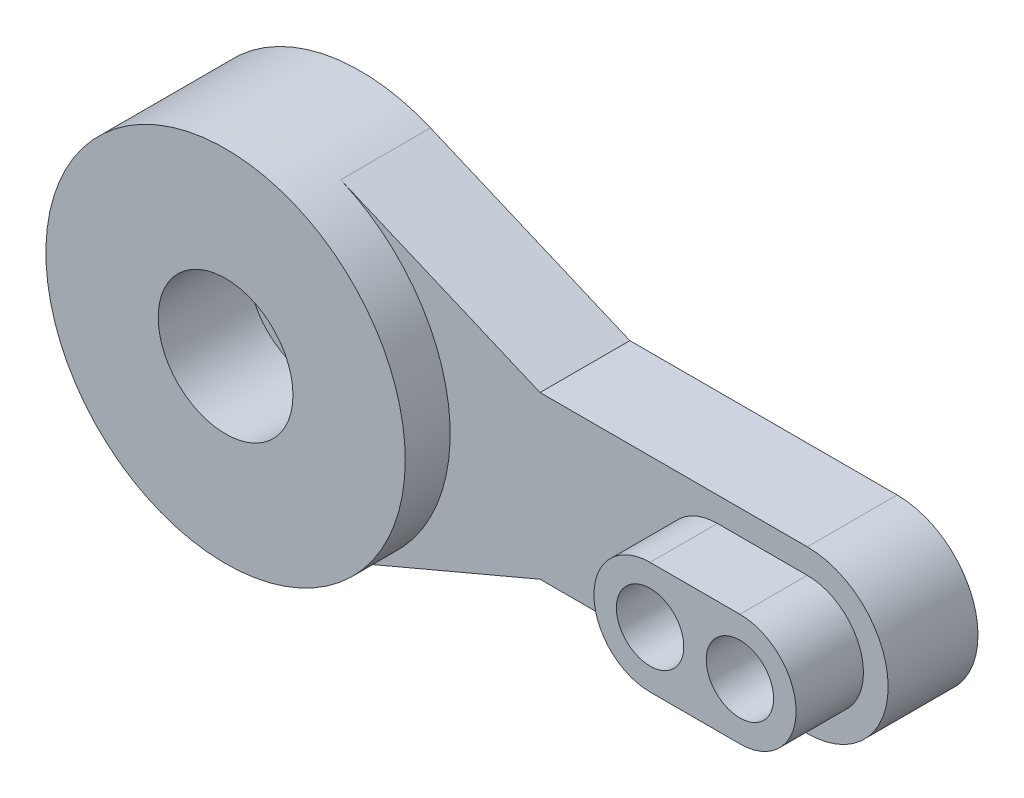
ISO-10303-21;
HEADER;
FILE_DESCRIPTION(('STEP AP214'),'2;1');
FILE_NAME('part.step','',(''),(''),'','','');
FILE_SCHEMA(('AUTOMOTIVE_DESIGN { 1 0 10303 214 1 1 1 1 }'));
ENDSEC;
DATA;
#1=APPLICATION_CONTEXT('core data for automotive mechanical design processes');
#2=APPLICATION_PROTOCOL_DEFINITION('international standard','automotive_design',2000,#1);
#3=PRODUCT_CONTEXT('',#1,'mechanical');
#4=PRODUCT('Part','Part','',(#3));
#5=PRODUCT_RELATED_PRODUCT_CATEGORY('part','',(#4));
#6=PRODUCT_DEFINITION_FORMATION('','',#4);
#7=PRODUCT_DEFINITION_CONTEXT('part definition',#1,'design');
#8=PRODUCT_DEFINITION('design','',#6,#7);
#9=PRODUCT_DEFINITION_SHAPE('','',#8);
#10=(LENGTH_UNIT() NAMED_UNIT(*) SI_UNIT(.MILLI.,.METRE.));
#11=(NAMED_UNIT(*) PLANE_ANGLE_UNIT() SI_UNIT($,.RADIAN.));
#12=(NAMED_UNIT(*) SI_UNIT($,.STERADIAN.) SOLID_ANGLE_UNIT());
#13=UNCERTAINTY_MEASURE_WITH_UNIT(LENGTH_MEASURE(1.E-05),#10,'distance_accuracy_value','');
#14=(GEOMETRIC_REPRESENTATION_CONTEXT(3) GLOBAL_UNCERTAINTY_ASSIGNED_CONTEXT((#13)) GLOBAL_UNIT_ASSIGNED_CONTEXT((#10,
#11,#12)) REPRESENTATION_CONTEXT('',''));
#15=CARTESIAN_POINT('',(0.,0.,0.));
#16=DIRECTION('',(0.,0.,1.));
#17=DIRECTION('',(1.,0.,0.));
#18=AXIS2_PLACEMENT_3D('',#15,#16,#17);
#19=CARTESIAN_POINT('',(0.,0.,4.));
#20=DIRECTION('',(0.,0.,1.));
#21=DIRECTION('',(1.,0.,0.));
#22=AXIS2_PLACEMENT_3D('',#19,#20,#21);
#23=PLANE('',#22);
#24=CARTESIAN_POINT('',(0.,0.,4.));
#25=DIRECTION('',(0.,0.,1.));
#26=DIRECTION('',(1.,0.,0.));
#27=AXIS2_PLACEMENT_3D('',#24,#25,#26);
#28=CIRCLE('',#27,8.);
#29=CARTESIAN_POINT('',(3.12386973066267,-7.36487867556891,4.));
#30=VERTEX_POINT('',#29);
#31=CARTESIAN_POINT('',(3.12386973066266,7.3648786755689,4.));
#32=VERTEX_POINT('',#31);
#33=EDGE_CURVE('E12',#30,#32,#28,.T.);
#34=ORIENTED_EDGE('',*,*,#33,.F.);
#35=DIRECTION('',(0.920609834446113,0.390483716332833,0.));
#36=VECTOR('',#35,1.);
#37=CARTESIAN_POINT('',(3.12386973066267,-7.36487867556891,4.));
#38=LINE('',#37,#36);
#39=CARTESIAN_POINT('',(12.,-3.6,4.));
#40=VERTEX_POINT('',#39);
#41=EDGE_CURVE('E106',#30,#40,#38,.T.);
#42=ORIENTED_EDGE('',*,*,#41,.T.);
#43=DIRECTION('',(1.,0.,0.));
#44=VECTOR('',#43,1.);
#45=CARTESIAN_POINT('',(12.,-3.6,4.));
#46=LINE('',#45,#44);
#47=CARTESIAN_POINT('',(23.9,-3.6,4.));
#48=VERTEX_POINT('',#47);
#49=EDGE_CURVE('E100',#40,#48,#46,.T.);
#50=ORIENTED_EDGE('',*,*,#49,.T.);
#51=CARTESIAN_POINT('',(23.9,0.,4.));
#52=DIRECTION('',(0.,0.,1.));
#53=DIRECTION('',(1.,0.,0.));
#54=AXIS2_PLACEMENT_3D('',#51,#52,#53);
#55=CIRCLE('',#54,3.6);
#56=CARTESIAN_POINT('',(23.9,3.6,4.));
#57=VERTEX_POINT('',#56);
#58=EDGE_CURVE('E104',#48,#57,#55,.T.);
#59=ORIENTED_EDGE('',*,*,#58,.T.);
#60=DIRECTION('',(-1.,0.,0.));
#61=VECTOR('',#60,1.);
#62=CARTESIAN_POINT('',(12.,3.6,4.));
#63=LINE('',#62,#61);
#64=CARTESIAN_POINT('',(12.,3.6,4.));
#65=VERTEX_POINT('',#64);
#66=EDGE_CURVE('E60',#57,#65,#63,.T.);
#67=ORIENTED_EDGE('',*,*,#66,.T.);
#68=DIRECTION('',(-0.920609834446113,0.390483716332833,0.));
#69=VECTOR('',#68,1.);
#70=CARTESIAN_POINT('',(3.12386973066267,7.36487867556891,4.));
#71=LINE('',#70,#69);
#72=EDGE_CURVE('E124',#65,#32,#71,.T.);
#73=ORIENTED_EDGE('',*,*,#72,.T.);
#74=EDGE_LOOP('',(#34,#42,#50,#59,#67,#73));
#75=FACE_BOUND('',#74,.T.);
#76=DIRECTION('',(-1.,0.,0.));
#77=VECTOR('',#76,1.);
#78=CARTESIAN_POINT('',(23.9,2.5,4.));
#79=LINE('',#78,#77);
#80=CARTESIAN_POINT('',(23.9,2.5,4.));
#81=VERTEX_POINT('',#80);
#82=CARTESIAN_POINT('',(19.9,2.5,4.));
#83=VERTEX_POINT('',#82);
#84=EDGE_CURVE('E200',#81,#83,#79,.T.);
#85=ORIENTED_EDGE('',*,*,#84,.F.);
#86=CARTESIAN_POINT('',(23.9,0.,4.));
#87=DIRECTION('',(0.,0.,1.));
#88=DIRECTION('',(1.,0.,0.));
#89=AXIS2_PLACEMENT_3D('',#86,#87,#88);
#90=CIRCLE('',#89,2.5);
#91=CARTESIAN_POINT('',(23.9,-2.5,4.));
#92=VERTEX_POINT('',#91);
#93=EDGE_CURVE('E211',#92,#81,#90,.T.);
#94=ORIENTED_EDGE('',*,*,#93,.F.);
#95=DIRECTION('',(1.,0.,0.));
#96=VECTOR('',#95,1.);
#97=CARTESIAN_POINT('',(23.9,-2.5,4.));
#98=LINE('',#97,#96);
#99=CARTESIAN_POINT('',(19.9,-2.5,4.));
#100=VERTEX_POINT('',#99);
#101=EDGE_CURVE('E181',#100,#92,#98,.T.);
#102=ORIENTED_EDGE('',*,*,#101,.F.);
#103=CARTESIAN_POINT('',(19.9,0.,4.));
#104=DIRECTION('',(0.,0.,1.));
#105=DIRECTION('',(1.,0.,0.));
#106=AXIS2_PLACEMENT_3D('',#103,#104,#105);
#107=CIRCLE('',#106,2.5);
#108=EDGE_CURVE('E216',#83,#100,#107,.T.);
#109=ORIENTED_EDGE('',*,*,#108,.F.);
#110=EDGE_LOOP('',(#85,#94,#102,#109));
#111=FACE_BOUND('',#110,.T.);
#112=ADVANCED_FACE('F35',(#75,#111),#23,.T.);
#113=CARTESIAN_POINT('',(0.,0.,4.));
#114=DIRECTION('',(0.,0.,-1.));
#115=DIRECTION('',(-1.,0.,0.));
#116=AXIS2_PLACEMENT_3D('',#113,#114,#115);
#117=CYLINDRICAL_SURFACE('',#116,8.);
#118=CARTESIAN_POINT('',(0.,0.,0.));
#119=DIRECTION('',(0.,0.,1.));
#120=DIRECTION('',(1.,0.,0.));
#121=AXIS2_PLACEMENT_3D('',#118,#119,#120);
#122=CIRCLE('',#121,8.);
#123=CARTESIAN_POINT('',(3.12386973066267,7.36487867556891,0.));
#124=VERTEX_POINT('',#123);
#125=CARTESIAN_POINT('',(3.12386973066267,-7.36487867556891,0.));
#126=VERTEX_POINT('',#125);
#127=EDGE_CURVE('E130',#124,#126,#122,.T.);
#128=ORIENTED_EDGE('',*,*,#127,.T.);
#129=DIRECTION('',(0.,0.,-1.));
#130=VECTOR('',#129,1.);
#131=CARTESIAN_POINT('',(3.12386973066267,-7.36487867556891,4.));
#132=LINE('',#131,#130);
#133=EDGE_CURVE('E39',#30,#126,#132,.T.);
#134=ORIENTED_EDGE('',*,*,#133,.F.);
#135=ORIENTED_EDGE('',*,*,#33,.T.);
#136=DIRECTION('',(0.,0.,-1.));
#137=VECTOR('',#136,1.);
#138=CARTESIAN_POINT('',(3.12386973066267,7.36487867556891,4.));
#139=LINE('',#138,#137);
#140=EDGE_CURVE('E129',#32,#124,#139,.T.);
#141=ORIENTED_EDGE('',*,*,#140,.T.);
#142=EDGE_LOOP('',(#128,#134,#135,#141));
#143=FACE_BOUND('',#142,.T.);
#144=CARTESIAN_POINT('',(0.,0.,6.));
#145=DIRECTION('',(0.,0.,1.));
#146=DIRECTION('',(1.,0.,0.));
#147=AXIS2_PLACEMENT_3D('',#144,#145,#146);
#148=CIRCLE('',#147,8.);
#149=CARTESIAN_POINT('',(8.,0.,6.));
#150=VERTEX_POINT('',#149);
#151=EDGE_CURVE('E134',#150,#150,#148,.T.);
#152=ORIENTED_EDGE('',*,*,#151,.F.);
#153=EDGE_LOOP('',(#152));
#154=FACE_BOUND('',#153,.T.);
#155=ADVANCED_FACE('F37',(#143,#154),#117,.T.);
#156=CARTESIAN_POINT('',(3.12386973066267,-7.36487867556891,4.));
#157=DIRECTION('',(-0.390483716332833,0.920609834446113,0.));
#158=DIRECTION('',(-0.920609834446113,-0.390483716332833,0.));
#159=AXIS2_PLACEMENT_3D('',#156,#157,#158);
#160=PLANE('',#159);
#161=DIRECTION('',(0.920609834446113,0.390483716332833,0.));
#162=VECTOR('',#161,1.);
#163=CARTESIAN_POINT('',(3.12386973066267,-7.36487867556891,0.));
#164=LINE('',#163,#162);
#165=CARTESIAN_POINT('',(12.,-3.6,0.));
#166=VERTEX_POINT('',#165);
#167=EDGE_CURVE('E133',#126,#166,#164,.T.);
#168=ORIENTED_EDGE('',*,*,#167,.T.);
#169=DIRECTION('',(0.,0.,-1.));
#170=VECTOR('',#169,1.);
#171=CARTESIAN_POINT('',(12.,-3.6,4.));
#172=LINE('',#171,#170);
#173=EDGE_CURVE('E118',#40,#166,#172,.T.);
#174=ORIENTED_EDGE('',*,*,#173,.F.);
#175=ORIENTED_EDGE('',*,*,#41,.F.);
#176=ORIENTED_EDGE('',*,*,#133,.T.);
#177=EDGE_LOOP('',(#168,#174,#175,#176));
#178=FACE_BOUND('',#177,.T.);
#179=ADVANCED_FACE('F148',(#178),#160,.F.);
#180=CARTESIAN_POINT('',(12.,-3.6,4.));
#181=DIRECTION('',(0.,1.,0.));
#182=DIRECTION('',(-1.,0.,0.));
#183=AXIS2_PLACEMENT_3D('',#180,#181,#182);
#184=PLANE('',#183);
#185=DIRECTION('',(1.,0.,0.));
#186=VECTOR('',#185,1.);
#187=CARTESIAN_POINT('',(12.,-3.6,0.));
#188=LINE('',#187,#186);
#189=CARTESIAN_POINT('',(23.9,-3.6,0.));
#190=VERTEX_POINT('',#189);
#191=EDGE_CURVE('E115',#166,#190,#188,.T.);
#192=ORIENTED_EDGE('',*,*,#191,.T.);
#193=DIRECTION('',(0.,0.,-1.));
#194=VECTOR('',#193,1.);
#195=CARTESIAN_POINT('',(23.9,-3.6,4.));
#196=LINE('',#195,#194);
#197=EDGE_CURVE('E112',#48,#190,#196,.T.);
#198=ORIENTED_EDGE('',*,*,#197,.F.);
#199=ORIENTED_EDGE('',*,*,#49,.F.);
#200=ORIENTED_EDGE('',*,*,#173,.T.);
#201=EDGE_LOOP('',(#192,#198,#199,#200));
#202=FACE_BOUND('',#201,.T.);
#203=ADVANCED_FACE('F113',(#202),#184,.F.);
#204=CARTESIAN_POINT('',(23.9,0.,4.));
#205=DIRECTION('',(0.,0.,-1.));
#206=DIRECTION('',(-1.,0.,0.));
#207=AXIS2_PLACEMENT_3D('',#204,#205,#206);
#208=CYLINDRICAL_SURFACE('',#207,3.6);
#209=CARTESIAN_POINT('',(23.9,0.,0.));
#210=DIRECTION('',(0.,0.,1.));
#211=DIRECTION('',(1.,0.,0.));
#212=AXIS2_PLACEMENT_3D('',#209,#210,#211);
#213=CIRCLE('',#212,3.6);
#214=CARTESIAN_POINT('',(23.9,3.6,0.));
#215=VERTEX_POINT('',#214);
#216=EDGE_CURVE('E137',#190,#215,#213,.T.);
#217=ORIENTED_EDGE('',*,*,#216,.T.);
#218=DIRECTION('',(0.,0.,-1.));
#219=VECTOR('',#218,1.);
#220=CARTESIAN_POINT('',(23.9,3.6,4.));
#221=LINE('',#220,#219);
#222=EDGE_CURVE('E119',#57,#215,#221,.T.);
#223=ORIENTED_EDGE('',*,*,#222,.F.);
#224=ORIENTED_EDGE('',*,*,#58,.F.);
#225=ORIENTED_EDGE('',*,*,#197,.T.);
#226=EDGE_LOOP('',(#217,#223,#224,#225));
#227=FACE_BOUND('',#226,.T.);
#228=ADVANCED_FACE('F121',(#227),#208,.T.);
#229=CARTESIAN_POINT('',(12.,3.6,4.));
#230=DIRECTION('',(0.,-1.,0.));
#231=DIRECTION('',(1.,0.,0.));
#232=AXIS2_PLACEMENT_3D('',#229,#230,#231);
#233=PLANE('',#232);
#234=DIRECTION('',(-1.,0.,0.));
#235=VECTOR('',#234,1.);
#236=CARTESIAN_POINT('',(12.,3.6,0.));
#237=LINE('',#236,#235);
#238=CARTESIAN_POINT('',(12.,3.6,0.));
#239=VERTEX_POINT('',#238);
#240=EDGE_CURVE('E139',#215,#239,#237,.T.);
#241=ORIENTED_EDGE('',*,*,#240,.T.);
#242=DIRECTION('',(0.,0.,-1.));
#243=VECTOR('',#242,1.);
#244=CARTESIAN_POINT('',(12.,3.6,4.));
#245=LINE('',#244,#243);
#246=EDGE_CURVE('E143',#65,#239,#245,.T.);
#247=ORIENTED_EDGE('',*,*,#246,.F.);
#248=ORIENTED_EDGE('',*,*,#66,.F.);
#249=ORIENTED_EDGE('',*,*,#222,.T.);
#250=EDGE_LOOP('',(#241,#247,#248,#249));
#251=FACE_BOUND('',#250,.T.);
#252=ADVANCED_FACE('F157',(#251),#233,.F.);
#253=CARTESIAN_POINT('',(3.12386973066267,7.36487867556891,4.));
#254=DIRECTION('',(-0.390483716332833,-0.920609834446113,0.));
#255=DIRECTION('',(0.920609834446113,-0.390483716332833,0.));
#256=AXIS2_PLACEMENT_3D('',#253,#254,#255);
#257=PLANE('',#256);
#258=DIRECTION('',(-0.920609834446113,0.390483716332833,0.));
#259=VECTOR('',#258,1.);
#260=CARTESIAN_POINT('',(3.12386973066267,7.36487867556891,0.));
#261=LINE('',#260,#259);
#262=EDGE_CURVE('E88',#239,#124,#261,.T.);
#263=ORIENTED_EDGE('',*,*,#262,.T.);
#264=ORIENTED_EDGE('',*,*,#140,.F.);
#265=ORIENTED_EDGE('',*,*,#72,.F.);
#266=ORIENTED_EDGE('',*,*,#246,.T.);
#267=EDGE_LOOP('',(#263,#264,#265,#266));
#268=FACE_BOUND('',#267,.T.);
#269=ADVANCED_FACE('F159',(#268),#257,.F.);
#270=CARTESIAN_POINT('',(0.,0.,0.));
#271=DIRECTION('',(0.,0.,1.));
#272=DIRECTION('',(1.,0.,0.));
#273=AXIS2_PLACEMENT_3D('',#270,#271,#272);
#274=PLANE('',#273);
#275=CARTESIAN_POINT('',(23.9,0.,0.));
#276=DIRECTION('',(0.,0.,-1.));
#277=DIRECTION('',(-1.,0.,0.));
#278=AXIS2_PLACEMENT_3D('',#275,#276,#277);
#279=CIRCLE('',#278,1.49999999999999);
#280=CARTESIAN_POINT('',(22.4,0.,0.));
#281=VERTEX_POINT('',#280);
#282=EDGE_CURVE('E409',#281,#281,#279,.T.);
#283=ORIENTED_EDGE('',*,*,#282,.F.);
#284=EDGE_LOOP('',(#283));
#285=FACE_BOUND('',#284,.T.);
#286=CARTESIAN_POINT('',(19.9,0.,0.));
#287=DIRECTION('',(0.,0.,-1.));
#288=DIRECTION('',(-1.,0.,0.));
#289=AXIS2_PLACEMENT_3D('',#286,#287,#288);
#290=CIRCLE('',#289,1.49999999999999);
#291=CARTESIAN_POINT('',(18.4,0.,0.));
#292=VERTEX_POINT('',#291);
#293=EDGE_CURVE('E420',#292,#292,#290,.T.);
#294=ORIENTED_EDGE('',*,*,#293,.F.);
#295=EDGE_LOOP('',(#294));
#296=FACE_BOUND('',#295,.T.);
#297=ORIENTED_EDGE('',*,*,#127,.F.);
#298=ORIENTED_EDGE('',*,*,#262,.F.);
#299=ORIENTED_EDGE('',*,*,#240,.F.);
#300=ORIENTED_EDGE('',*,*,#216,.F.);
#301=ORIENTED_EDGE('',*,*,#191,.F.);
#302=ORIENTED_EDGE('',*,*,#167,.F.);
#303=EDGE_LOOP('',(#297,#298,#299,#300,#301,#302));
#304=FACE_BOUND('',#303,.T.);
#305=CARTESIAN_POINT('',(0.,0.,0.));
#306=DIRECTION('',(0.,0.,1.));
#307=DIRECTION('',(1.,0.,0.));
#308=AXIS2_PLACEMENT_3D('',#305,#306,#307);
#309=CIRCLE('',#308,2.);
#310=CARTESIAN_POINT('',(-2.,0.,0.));
#311=VERTEX_POINT('',#310);
#312=EDGE_CURVE('E406',#311,#311,#309,.T.);
#313=ORIENTED_EDGE('',*,*,#312,.T.);
#314=EDGE_LOOP('',(#313));
#315=FACE_BOUND('',#314,.T.);
#316=ADVANCED_FACE('F153',(#285,#296,#304,#315),#274,.F.);
#317=CARTESIAN_POINT('',(0.,0.,6.));
#318=DIRECTION('',(0.,0.,1.));
#319=DIRECTION('',(1.,0.,0.));
#320=AXIS2_PLACEMENT_3D('',#317,#318,#319);
#321=PLANE('',#320);
#322=CARTESIAN_POINT('',(0.,0.,6.));
#323=DIRECTION('',(0.,0.,1.));
#324=DIRECTION('',(1.,0.,0.));
#325=AXIS2_PLACEMENT_3D('',#322,#323,#324);
#326=CIRCLE('',#325,3.);
#327=CARTESIAN_POINT('',(3.,0.,6.));
#328=VERTEX_POINT('',#327);
#329=EDGE_CURVE('E405',#328,#328,#326,.T.);
#330=ORIENTED_EDGE('',*,*,#329,.F.);
#331=EDGE_LOOP('',(#330));
#332=FACE_BOUND('',#331,.T.);
#333=ORIENTED_EDGE('',*,*,#151,.T.);
#334=EDGE_LOOP('',(#333));
#335=FACE_BOUND('',#334,.T.);
#336=ADVANCED_FACE('F225',(#332,#335),#321,.T.);
#337=CARTESIAN_POINT('',(23.9,0.,7.));
#338=DIRECTION('',(0.,0.,-1.));
#339=DIRECTION('',(-1.,0.,0.));
#340=AXIS2_PLACEMENT_3D('',#337,#338,#339);
#341=CYLINDRICAL_SURFACE('',#340,2.5);
#342=ORIENTED_EDGE('',*,*,#93,.T.);
#343=DIRECTION('',(0.,0.,-1.));
#344=VECTOR('',#343,1.);
#345=CARTESIAN_POINT('',(23.9,2.5,7.));
#346=LINE('',#345,#344);
#347=CARTESIAN_POINT('',(23.9,2.5,7.));
#348=VERTEX_POINT('',#347);
#349=EDGE_CURVE('E203',#348,#81,#346,.T.);
#350=ORIENTED_EDGE('',*,*,#349,.F.);
#351=CARTESIAN_POINT('',(23.9,0.,7.));
#352=DIRECTION('',(0.,0.,1.));
#353=DIRECTION('',(1.,0.,0.));
#354=AXIS2_PLACEMENT_3D('',#351,#352,#353);
#355=CIRCLE('',#354,2.5);
#356=CARTESIAN_POINT('',(23.9,-2.5,7.));
#357=VERTEX_POINT('',#356);
#358=EDGE_CURVE('E193',#357,#348,#355,.T.);
#359=ORIENTED_EDGE('',*,*,#358,.F.);
#360=DIRECTION('',(0.,0.,-1.));
#361=VECTOR('',#360,1.);
#362=CARTESIAN_POINT('',(23.9,-2.5,7.));
#363=LINE('',#362,#361);
#364=EDGE_CURVE('E207',#357,#92,#363,.T.);
#365=ORIENTED_EDGE('',*,*,#364,.T.);
#366=EDGE_LOOP('',(#342,#350,#359,#365));
#367=FACE_BOUND('',#366,.T.);
#368=ADVANCED_FACE('F269',(#367),#341,.T.);
#369=CARTESIAN_POINT('',(23.9,2.5,7.));
#370=DIRECTION('',(0.,-1.,0.));
#371=DIRECTION('',(0.,0.,-1.));
#372=AXIS2_PLACEMENT_3D('',#369,#370,#371);
#373=PLANE('',#372);
#374=ORIENTED_EDGE('',*,*,#84,.T.);
#375=DIRECTION('',(0.,0.,-1.));
#376=VECTOR('',#375,1.);
#377=CARTESIAN_POINT('',(19.9,2.5,7.));
#378=LINE('',#377,#376);
#379=CARTESIAN_POINT('',(19.9,2.5,7.));
#380=VERTEX_POINT('',#379);
#381=EDGE_CURVE('E197',#380,#83,#378,.T.);
#382=ORIENTED_EDGE('',*,*,#381,.F.);
#383=DIRECTION('',(-1.,0.,0.));
#384=VECTOR('',#383,1.);
#385=CARTESIAN_POINT('',(23.9,2.5,7.));
#386=LINE('',#385,#384);
#387=EDGE_CURVE('E188',#348,#380,#386,.T.);
#388=ORIENTED_EDGE('',*,*,#387,.F.);
#389=ORIENTED_EDGE('',*,*,#349,.T.);
#390=EDGE_LOOP('',(#374,#382,#388,#389));
#391=FACE_BOUND('',#390,.T.);
#392=ADVANCED_FACE('F198',(#391),#373,.F.);
#393=CARTESIAN_POINT('',(19.9,0.,7.));
#394=DIRECTION('',(0.,0.,-1.));
#395=DIRECTION('',(-1.,0.,0.));
#396=AXIS2_PLACEMENT_3D('',#393,#394,#395);
#397=CYLINDRICAL_SURFACE('',#396,2.5);
#398=ORIENTED_EDGE('',*,*,#108,.T.);
#399=DIRECTION('',(0.,0.,-1.));
#400=VECTOR('',#399,1.);
#401=CARTESIAN_POINT('',(19.9,-2.5,7.));
#402=LINE('',#401,#400);
#403=CARTESIAN_POINT('',(19.9,-2.5,7.));
#404=VERTEX_POINT('',#403);
#405=EDGE_CURVE('E51',#404,#100,#402,.T.);
#406=ORIENTED_EDGE('',*,*,#405,.F.);
#407=CARTESIAN_POINT('',(19.9,0.,7.));
#408=DIRECTION('',(0.,0.,1.));
#409=DIRECTION('',(1.,0.,0.));
#410=AXIS2_PLACEMENT_3D('',#407,#408,#409);
#411=CIRCLE('',#410,2.5);
#412=EDGE_CURVE('E191',#380,#404,#411,.T.);
#413=ORIENTED_EDGE('',*,*,#412,.F.);
#414=ORIENTED_EDGE('',*,*,#381,.T.);
#415=EDGE_LOOP('',(#398,#406,#413,#414));
#416=FACE_BOUND('',#415,.T.);
#417=ADVANCED_FACE('F205',(#416),#397,.T.);
#418=CARTESIAN_POINT('',(23.9,-2.5,7.));
#419=DIRECTION('',(0.,1.,0.));
#420=DIRECTION('',(-1.,0.,0.));
#421=AXIS2_PLACEMENT_3D('',#418,#419,#420);
#422=PLANE('',#421);
#423=ORIENTED_EDGE('',*,*,#101,.T.);
#424=ORIENTED_EDGE('',*,*,#364,.F.);
#425=DIRECTION('',(1.,0.,0.));
#426=VECTOR('',#425,1.);
#427=CARTESIAN_POINT('',(23.9,-2.5,7.));
#428=LINE('',#427,#426);
#429=EDGE_CURVE('E167',#404,#357,#428,.T.);
#430=ORIENTED_EDGE('',*,*,#429,.F.);
#431=ORIENTED_EDGE('',*,*,#405,.T.);
#432=EDGE_LOOP('',(#423,#424,#430,#431));
#433=FACE_BOUND('',#432,.T.);
#434=ADVANCED_FACE('F290',(#433),#422,.F.);
#435=CARTESIAN_POINT('',(23.9,0.,7.));
#436=DIRECTION('',(0.,0.,1.));
#437=DIRECTION('',(1.,0.,0.));
#438=AXIS2_PLACEMENT_3D('',#435,#436,#437);
#439=PLANE('',#438);
#440=CARTESIAN_POINT('',(23.9,0.,7.));
#441=DIRECTION('',(0.,0.,-1.));
#442=DIRECTION('',(-1.,0.,0.));
#443=AXIS2_PLACEMENT_3D('',#440,#441,#442);
#444=CIRCLE('',#443,1.5);
#445=CARTESIAN_POINT('',(22.4,0.,7.));
#446=VERTEX_POINT('',#445);
#447=EDGE_CURVE('E417',#446,#446,#444,.T.);
#448=ORIENTED_EDGE('',*,*,#447,.T.);
#449=EDGE_LOOP('',(#448));
#450=FACE_BOUND('',#449,.T.);
#451=CARTESIAN_POINT('',(19.9,0.,7.));
#452=DIRECTION('',(0.,0.,-1.));
#453=DIRECTION('',(-1.,0.,0.));
#454=AXIS2_PLACEMENT_3D('',#451,#452,#453);
#455=CIRCLE('',#454,1.5);
#456=CARTESIAN_POINT('',(18.4,0.,7.));
#457=VERTEX_POINT('',#456);
#458=EDGE_CURVE('E214',#457,#457,#455,.T.);
#459=ORIENTED_EDGE('',*,*,#458,.T.);
#460=EDGE_LOOP('',(#459));
#461=FACE_BOUND('',#460,.T.);
#462=ORIENTED_EDGE('',*,*,#358,.T.);
#463=ORIENTED_EDGE('',*,*,#387,.T.);
#464=ORIENTED_EDGE('',*,*,#412,.T.);
#465=ORIENTED_EDGE('',*,*,#429,.T.);
#466=EDGE_LOOP('',(#462,#463,#464,#465));
#467=FACE_BOUND('',#466,.T.);
#468=ADVANCED_FACE('F189',(#450,#461,#467),#439,.T.);
#469=CARTESIAN_POINT('',(19.9,0.,0.));
#470=DIRECTION('',(0.,0.,-1.));
#471=DIRECTION('',(-1.,0.,0.));
#472=AXIS2_PLACEMENT_3D('',#469,#470,#471);
#473=CYLINDRICAL_SURFACE('',#472,1.49999999999999);
#474=ORIENTED_EDGE('',*,*,#458,.F.);
#475=EDGE_LOOP('',(#474));
#476=FACE_BOUND('',#475,.T.);
#477=ORIENTED_EDGE('',*,*,#293,.T.);
#478=EDGE_LOOP('',(#477));
#479=FACE_BOUND('',#478,.T.);
#480=ADVANCED_FACE('F303',(#476,#479),#473,.F.);
#481=CARTESIAN_POINT('',(23.9,0.,0.));
#482=DIRECTION('',(0.,0.,-1.));
#483=DIRECTION('',(-1.,0.,0.));
#484=AXIS2_PLACEMENT_3D('',#481,#482,#483);
#485=CYLINDRICAL_SURFACE('',#484,1.49999999999999);
#486=ORIENTED_EDGE('',*,*,#447,.F.);
#487=EDGE_LOOP('',(#486));
#488=FACE_BOUND('',#487,.T.);
#489=ORIENTED_EDGE('',*,*,#282,.T.);
#490=EDGE_LOOP('',(#489));
#491=FACE_BOUND('',#490,.T.);
#492=ADVANCED_FACE('F311',(#488,#491),#485,.F.);
#493=CARTESIAN_POINT('',(0.,0.,0.));
#494=DIRECTION('',(0.,0.,-1.));
#495=DIRECTION('',(-1.,0.,0.));
#496=AXIS2_PLACEMENT_3D('',#493,#494,#495);
#497=CYLINDRICAL_SURFACE('',#496,3.);
#498=CARTESIAN_POINT('',(0.,0.,2.));
#499=DIRECTION('',(0.,0.,1.));
#500=DIRECTION('',(1.,0.,0.));
#501=AXIS2_PLACEMENT_3D('',#498,#499,#500);
#502=CIRCLE('',#501,3.);
#503=CARTESIAN_POINT('',(3.,0.,2.));
#504=VERTEX_POINT('',#503);
#505=EDGE_CURVE('E404',#504,#504,#502,.T.);
#506=ORIENTED_EDGE('',*,*,#505,.F.);
#507=EDGE_LOOP('',(#506));
#508=FACE_BOUND('',#507,.T.);
#509=ORIENTED_EDGE('',*,*,#329,.T.);
#510=EDGE_LOOP('',(#509));
#511=FACE_BOUND('',#510,.T.);
#512=ADVANCED_FACE('F318',(#508,#511),#497,.F.);
#513=CARTESIAN_POINT('',(0.,0.,14.4852813742386));
#514=DIRECTION('',(0.,0.,-1.));
#515=DIRECTION('',(-1.,0.,0.));
#516=AXIS2_PLACEMENT_3D('',#513,#514,#515);
#517=CYLINDRICAL_SURFACE('',#516,2.);
#518=CARTESIAN_POINT('',(0.,0.,2.));
#519=DIRECTION('',(0.,0.,1.));
#520=DIRECTION('',(1.,0.,0.));
#521=AXIS2_PLACEMENT_3D('',#518,#519,#520);
#522=CIRCLE('',#521,2.);
#523=CARTESIAN_POINT('',(-2.,0.,2.));
#524=VERTEX_POINT('',#523);
#525=EDGE_CURVE('E401',#524,#524,#522,.T.);
#526=CARTESIAN_POINT('',(-2.,0.,0.));
#527=CARTESIAN_POINT('',(-2.,0.,0.0208333333333333));
#528=CARTESIAN_POINT('',(-2.,0.,0.0416666666666667));
#529=CARTESIAN_POINT('',(-2.,0.,0.0833333333333334));
#530=CARTESIAN_POINT('',(-2.,0.,0.104166666666667));
#531=CARTESIAN_POINT('',(-2.,0.,0.145833333333333));
#532=CARTESIAN_POINT('',(-2.,0.,0.166666666666667));
#533=CARTESIAN_POINT('',(-2.,0.,0.208333333333334));
#534=CARTESIAN_POINT('',(-2.,0.,0.229166666666667));
#535=CARTESIAN_POINT('',(-2.,0.,0.270833333333334));
#536=CARTESIAN_POINT('',(-2.,0.,0.291666666666667));
#537=CARTESIAN_POINT('',(-2.,0.,0.333333333333334));
#538=CARTESIAN_POINT('',(-2.,0.,0.354166666666667));
#539=CARTESIAN_POINT('',(-2.,0.,0.395833333333334));
#540=CARTESIAN_POINT('',(-2.,0.,0.416666666666667));
#541=CARTESIAN_POINT('',(-2.,0.,0.458333333333334));
#542=CARTESIAN_POINT('',(-2.,0.,0.479166666666667));
#543=CARTESIAN_POINT('',(-2.,0.,0.520833333333333));
#544=CARTESIAN_POINT('',(-2.,0.,0.541666666666666));
#545=CARTESIAN_POINT('',(-2.,0.,0.583333333333332));
#546=CARTESIAN_POINT('',(-2.,0.,0.604166666666666));
#547=CARTESIAN_POINT('',(-2.,0.,0.645833333333332));
#548=CARTESIAN_POINT('',(-2.,0.,0.666666666666666));
#549=CARTESIAN_POINT('',(-2.,0.,0.708333333333332));
#550=CARTESIAN_POINT('',(-2.,0.,0.729166666666666));
#551=CARTESIAN_POINT('',(-2.,0.,0.770833333333332));
#552=CARTESIAN_POINT('',(-2.,0.,0.791666666666666));
#553=CARTESIAN_POINT('',(-2.,0.,0.833333333333332));
#554=CARTESIAN_POINT('',(-2.,0.,0.854166666666666));
#555=CARTESIAN_POINT('',(-2.,0.,0.895833333333332));
#556=CARTESIAN_POINT('',(-2.,0.,0.916666666666666));
#557=CARTESIAN_POINT('',(-2.,0.,0.958333333333332));
#558=CARTESIAN_POINT('',(-2.,0.,0.979166666666666));
#559=CARTESIAN_POINT('',(-2.,0.,1.02083333333333));
#560=CARTESIAN_POINT('',(-2.,0.,1.04166666666667));
#561=CARTESIAN_POINT('',(-2.,0.,1.08333333333333));
#562=CARTESIAN_POINT('',(-2.,0.,1.10416666666667));
#563=CARTESIAN_POINT('',(-2.,0.,1.14583333333333));
#564=CARTESIAN_POINT('',(-2.,0.,1.16666666666667));
#565=CARTESIAN_POINT('',(-2.,0.,1.20833333333333));
#566=CARTESIAN_POINT('',(-2.,0.,1.22916666666667));
#567=CARTESIAN_POINT('',(-2.,0.,1.27083333333333));
#568=CARTESIAN_POINT('',(-2.,0.,1.29166666666667));
#569=CARTESIAN_POINT('',(-2.,0.,1.33333333333333));
#570=CARTESIAN_POINT('',(-2.,0.,1.35416666666667));
#571=CARTESIAN_POINT('',(-2.,0.,1.39583333333333));
#572=CARTESIAN_POINT('',(-2.,0.,1.41666666666666));
#573=CARTESIAN_POINT('',(-2.,0.,1.45833333333333));
#574=CARTESIAN_POINT('',(-2.,0.,1.47916666666666));
#575=CARTESIAN_POINT('',(-2.,0.,1.52083333333333));
#576=CARTESIAN_POINT('',(-2.,0.,1.54166666666666));
#577=CARTESIAN_POINT('',(-2.,0.,1.58333333333333));
#578=CARTESIAN_POINT('',(-2.,0.,1.60416666666666));
#579=CARTESIAN_POINT('',(-2.,0.,1.64583333333333));
#580=CARTESIAN_POINT('',(-2.,0.,1.66666666666666));
#581=CARTESIAN_POINT('',(-2.,0.,1.70833333333333));
#582=CARTESIAN_POINT('',(-2.,0.,1.72916666666666));
#583=CARTESIAN_POINT('',(-2.,0.,1.77083333333333));
#584=CARTESIAN_POINT('',(-2.,0.,1.79166666666666));
#585=CARTESIAN_POINT('',(-2.,0.,1.83333333333333));
#586=CARTESIAN_POINT('',(-2.,0.,1.85416666666666));
#587=CARTESIAN_POINT('',(-2.,0.,1.89583333333333));
#588=CARTESIAN_POINT('',(-2.,0.,1.91666666666666));
#589=CARTESIAN_POINT('',(-2.,0.,1.95833333333333));
#590=CARTESIAN_POINT('',(-2.,0.,1.97916666666667));
#591=CARTESIAN_POINT('',(-2.,0.,2.));
#592=B_SPLINE_CURVE_WITH_KNOTS('',3,(#526,#527,#528,#529,#530,#531,#532,#533,#534,#535,#536,
#537,#538,#539,#540,#541,#542,#543,#544,#545,#546,#547,#548,#549,#550,#551,#552,#553,#554,#555,
#556,#557,#558,#559,#560,#561,#562,#563,#564,#565,#566,#567,#568,#569,#570,#571,#572,#573,#574,
#575,#576,#577,#578,#579,#580,#581,#582,#583,#584,#585,#586,#587,#588,#589,#590,#591),
.UNSPECIFIED.,.F.,.F.,(4,2,2,2,2,2,2,2,2,2,2,2,2,2,2,2,2,2,2,2,2,2,2,2,2,2,2,2,2,2,2,2,4),(0.,
0.0625000000000001,0.125,0.1875,0.25,0.3125,0.375,0.4375,0.5,0.562499999999999,
0.624999999999999,0.687499999999999,0.749999999999999,0.812499999999999,0.874999999999999,
0.937499999999999,0.999999999999999,1.0625,1.125,1.1875,1.25,1.3125,1.375,1.4375,1.5,1.5625,
1.625,1.6875,1.75,1.8125,1.875,1.9375,2.),.UNSPECIFIED.);
#593=EDGE_CURVE('BSEAM326',#311,#524,#592,.T.);
#594=ORIENTED_EDGE('',*,*,#312,.F.);
#595=ORIENTED_EDGE('',*,*,#525,.T.);
#596=ORIENTED_EDGE('',*,*,#593,.T.);
#597=ORIENTED_EDGE('',*,*,#593,.F.);
#598=EDGE_LOOP('',(#594,#596,#595,#597));
#599=FACE_BOUND('',#598,.T.);
#600=ADVANCED_FACE('F326',(#599),#517,.F.);
#601=CARTESIAN_POINT('',(0.,0.,2.));
#602=DIRECTION('',(0.,0.,1.));
#603=DIRECTION('',(1.,0.,0.));
#604=AXIS2_PLACEMENT_3D('',#601,#602,#603);
#605=PLANE('',#604);
#606=ORIENTED_EDGE('',*,*,#525,.F.);
#607=EDGE_LOOP('',(#606));
#608=FACE_BOUND('',#607,.T.);
#609=ORIENTED_EDGE('',*,*,#505,.T.);
#610=EDGE_LOOP('',(#609));
#611=FACE_BOUND('',#610,.T.);
#612=ADVANCED_FACE('F339',(#608,#611),#605,.T.);
#613=CLOSED_SHELL('',(#112,#155,#179,#203,#228,#252,#269,#316,#336,#368,#392,#417,#434,#468,
#480,#492,#512,#600,#612));
#614=MANIFOLD_SOLID_BREP('B2',#613);
#615=ADVANCED_BREP_SHAPE_REPRESENTATION('',(#18,#614),#14);
#616=SHAPE_DEFINITION_REPRESENTATION(#9,#615);
ENDSEC;
END-ISO-10303-21;
